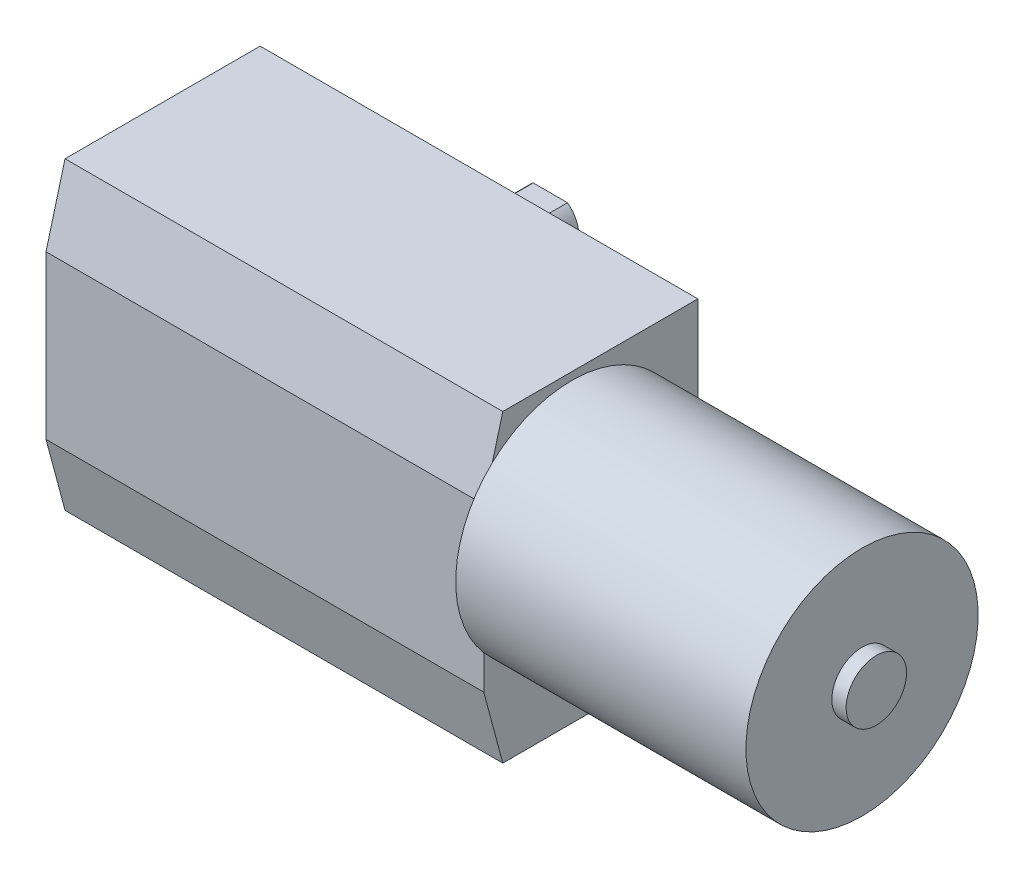
ISO-10303-21;
HEADER;
FILE_DESCRIPTION(('STEP AP214'),'2;1');
FILE_NAME('part.step','',(''),(''),'','','');
FILE_SCHEMA(('AUTOMOTIVE_DESIGN { 1 0 10303 214 1 1 1 1 }'));
ENDSEC;
DATA;
#1=APPLICATION_CONTEXT('core data for automotive mechanical design processes');
#2=APPLICATION_PROTOCOL_DEFINITION('international standard','automotive_design',2000,#1);
#3=PRODUCT_CONTEXT('',#1,'mechanical');
#4=PRODUCT('Part','Part','',(#3));
#5=PRODUCT_RELATED_PRODUCT_CATEGORY('part','',(#4));
#6=PRODUCT_DEFINITION_FORMATION('','',#4);
#7=PRODUCT_DEFINITION_CONTEXT('part definition',#1,'design');
#8=PRODUCT_DEFINITION('design','',#6,#7);
#9=PRODUCT_DEFINITION_SHAPE('','',#8);
#10=(LENGTH_UNIT() NAMED_UNIT(*) SI_UNIT(.MILLI.,.METRE.));
#11=(NAMED_UNIT(*) PLANE_ANGLE_UNIT() SI_UNIT($,.RADIAN.));
#12=(NAMED_UNIT(*) SI_UNIT($,.STERADIAN.) SOLID_ANGLE_UNIT());
#13=UNCERTAINTY_MEASURE_WITH_UNIT(LENGTH_MEASURE(1.E-05),#10,'distance_accuracy_value','');
#14=(GEOMETRIC_REPRESENTATION_CONTEXT(3) GLOBAL_UNCERTAINTY_ASSIGNED_CONTEXT((#13)) GLOBAL_UNIT_ASSIGNED_CONTEXT((#10,
#11,#12)) REPRESENTATION_CONTEXT('',''));
#15=CARTESIAN_POINT('',(0.,0.,0.));
#16=DIRECTION('',(0.,0.,1.));
#17=DIRECTION('',(1.,0.,0.));
#18=AXIS2_PLACEMENT_3D('',#15,#16,#17);
#19=CARTESIAN_POINT('',(61.5,3.00000000000001,2.));
#20=DIRECTION('',(1.,0.,0.));
#21=DIRECTION('',(0.,1.,0.));
#22=AXIS2_PLACEMENT_3D('',#19,#20,#21);
#23=PLANE('',#22);
#24=CARTESIAN_POINT('',(61.5,3.00000000000001,2.));
#25=DIRECTION('',(-1.,0.,0.));
#26=DIRECTION('',(0.,1.,0.));
#27=AXIS2_PLACEMENT_3D('',#24,#25,#26);
#28=CIRCLE('',#27,12.2);
#29=CARTESIAN_POINT('',(61.5,15.2,2.));
#30=VERTEX_POINT('',#29);
#31=EDGE_CURVE('E132',#30,#30,#28,.T.);
#32=ORIENTED_EDGE('',*,*,#31,.F.);
#33=EDGE_LOOP('',(#32));
#34=FACE_BOUND('',#33,.T.);
#35=CARTESIAN_POINT('',(61.5,3.00000000000001,2.));
#36=DIRECTION('',(-1.,0.,0.));
#37=DIRECTION('',(0.,1.,0.));
#38=AXIS2_PLACEMENT_3D('',#35,#36,#37);
#39=CIRCLE('',#38,3.175);
#40=CARTESIAN_POINT('',(61.5,6.17500000000001,2.));
#41=VERTEX_POINT('',#40);
#42=EDGE_CURVE('E437',#41,#41,#39,.T.);
#43=ORIENTED_EDGE('',*,*,#42,.T.);
#44=EDGE_LOOP('',(#43));
#45=FACE_BOUND('',#44,.T.);
#46=ADVANCED_FACE('F45',(#34,#45),#23,.T.);
#47=CARTESIAN_POINT('',(31.,16.,-11.25));
#48=DIRECTION('',(-1.,0.,0.));
#49=DIRECTION('',(0.,-1.,0.));
#50=AXIS2_PLACEMENT_3D('',#47,#48,#49);
#51=PLANE('',#50);
#52=CARTESIAN_POINT('',(31.,3.,2.));
#53=DIRECTION('',(-1.,0.,0.));
#54=DIRECTION('',(0.,1.,0.));
#55=AXIS2_PLACEMENT_3D('',#52,#53,#54);
#56=CIRCLE('',#55,12.2);
#57=CARTESIAN_POINT('',(31.,11.894821257883,10.3499793287357));
#58=VERTEX_POINT('',#57);
#59=CARTESIAN_POINT('',(31.,-4.95471558259627,11.25));
#60=VERTEX_POINT('',#59);
#61=EDGE_CURVE('E12',#58,#60,#56,.T.);
#62=ORIENTED_EDGE('',*,*,#61,.T.);
#63=DIRECTION('',(0.,1.,0.));
#64=VECTOR('',#63,1.);
#65=CARTESIAN_POINT('',(31.,16.,11.25));
#66=LINE('',#65,#64);
#67=CARTESIAN_POINT('',(31.,-8.53589838486227,11.25));
#68=VERTEX_POINT('',#67);
#69=EDGE_CURVE('E141',#68,#60,#66,.T.);
#70=ORIENTED_EDGE('',*,*,#69,.F.);
#71=DIRECTION('',(0.,-0.965925826289068,-0.258819045102522));
#72=VECTOR('',#71,1.);
#73=CARTESIAN_POINT('',(31.,-16.,9.25));
#74=LINE('',#73,#72);
#75=CARTESIAN_POINT('',(31.,-16.,9.25));
#76=VERTEX_POINT('',#75);
#77=EDGE_CURVE('E161',#76,#68,#74,.F.);
#78=ORIENTED_EDGE('',*,*,#77,.F.);
#79=DIRECTION('',(0.,0.,1.));
#80=VECTOR('',#79,1.);
#81=CARTESIAN_POINT('',(31.,-16.,-11.25));
#82=LINE('',#81,#80);
#83=CARTESIAN_POINT('',(31.,-16.,-11.25));
#84=VERTEX_POINT('',#83);
#85=EDGE_CURVE('E186',#84,#76,#82,.T.);
#86=ORIENTED_EDGE('',*,*,#85,.F.);
#87=DIRECTION('',(0.,1.,0.));
#88=VECTOR('',#87,1.);
#89=CARTESIAN_POINT('',(31.,16.,-11.25));
#90=LINE('',#89,#88);
#91=CARTESIAN_POINT('',(31.,16.,-11.25));
#92=VERTEX_POINT('',#91);
#93=EDGE_CURVE('E229',#84,#92,#90,.T.);
#94=ORIENTED_EDGE('',*,*,#93,.T.);
#95=DIRECTION('',(0.,0.,1.));
#96=VECTOR('',#95,1.);
#97=CARTESIAN_POINT('',(31.,16.,-11.25));
#98=LINE('',#97,#96);
#99=CARTESIAN_POINT('',(31.,16.,9.24999999999999));
#100=VERTEX_POINT('',#99);
#101=EDGE_CURVE('E158',#92,#100,#98,.T.);
#102=ORIENTED_EDGE('',*,*,#101,.T.);
#103=DIRECTION('',(0.,-0.965925826289068,0.258819045102522));
#104=VECTOR('',#103,1.);
#105=CARTESIAN_POINT('',(31.,16.,9.25));
#106=LINE('',#105,#104);
#107=EDGE_CURVE('E155',#58,#100,#106,.F.);
#108=ORIENTED_EDGE('',*,*,#107,.F.);
#109=EDGE_LOOP('',(#62,#70,#78,#86,#94,#102,#108));
#110=FACE_BOUND('',#109,.T.);
#111=ADVANCED_FACE('F153',(#110),#51,.F.);
#112=CARTESIAN_POINT('',(0.,0.,-12.75));
#113=DIRECTION('',(0.,0.,-1.));
#114=DIRECTION('',(1.,0.,0.));
#115=AXIS2_PLACEMENT_3D('',#112,#113,#114);
#116=PLANE('',#115);
#117=CARTESIAN_POINT('',(0.,0.,-12.75));
#118=DIRECTION('',(0.,0.,1.));
#119=DIRECTION('',(1.,0.,0.));
#120=AXIS2_PLACEMENT_3D('',#117,#118,#119);
#121=CIRCLE('',#120,6.);
#122=CARTESIAN_POINT('',(6.,0.,-12.75));
#123=VERTEX_POINT('',#122);
#124=EDGE_CURVE('E221',#123,#123,#121,.T.);
#125=ORIENTED_EDGE('',*,*,#124,.F.);
#126=EDGE_LOOP('',(#125));
#127=FACE_BOUND('',#126,.T.);
#128=CARTESIAN_POINT('',(0.,0.,-12.75));
#129=DIRECTION('',(0.,0.,1.));
#130=DIRECTION('',(1.,0.,0.));
#131=AXIS2_PLACEMENT_3D('',#128,#129,#130);
#132=CIRCLE('',#131,3.);
#133=CARTESIAN_POINT('',(3.,0.,-12.75));
#134=VERTEX_POINT('',#133);
#135=EDGE_CURVE('E389',#134,#134,#132,.T.);
#136=ORIENTED_EDGE('',*,*,#135,.T.);
#137=EDGE_LOOP('',(#136));
#138=FACE_BOUND('',#137,.T.);
#139=ADVANCED_FACE('F252',(#127,#138),#116,.T.);
#140=CARTESIAN_POINT('',(0.,0.,-11.25));
#141=DIRECTION('',(0.,0.,-1.));
#142=DIRECTION('',(1.,0.,0.));
#143=AXIS2_PLACEMENT_3D('',#140,#141,#142);
#144=PLANE('',#143);
#145=CARTESIAN_POINT('',(24.,9.,-11.25));
#146=DIRECTION('',(0.,0.,1.));
#147=DIRECTION('',(1.,0.,0.));
#148=AXIS2_PLACEMENT_3D('',#145,#146,#147);
#149=CIRCLE('',#148,3.825);
#150=CARTESIAN_POINT('',(27.825,9.,-11.25));
#151=VERTEX_POINT('',#150);
#152=EDGE_CURVE('E195',#151,#151,#149,.T.);
#153=ORIENTED_EDGE('',*,*,#152,.T.);
#154=EDGE_LOOP('',(#153));
#155=FACE_BOUND('',#154,.T.);
#156=CARTESIAN_POINT('',(-9.,9.,-11.25));
#157=DIRECTION('',(0.,0.,1.));
#158=DIRECTION('',(1.,0.,0.));
#159=AXIS2_PLACEMENT_3D('',#156,#157,#158);
#160=CIRCLE('',#159,3.825);
#161=CARTESIAN_POINT('',(-5.175,9.,-11.25));
#162=VERTEX_POINT('',#161);
#163=EDGE_CURVE('E201',#162,#162,#160,.T.);
#164=ORIENTED_EDGE('',*,*,#163,.T.);
#165=EDGE_LOOP('',(#164));
#166=FACE_BOUND('',#165,.T.);
#167=DIRECTION('',(0.,-1.,0.));
#168=VECTOR('',#167,1.);
#169=CARTESIAN_POINT('',(-15.,16.,-11.25));
#170=LINE('',#169,#168);
#171=CARTESIAN_POINT('',(-15.,16.,-11.25));
#172=VERTEX_POINT('',#171);
#173=CARTESIAN_POINT('',(-15.,-16.,-11.25));
#174=VERTEX_POINT('',#173);
#175=EDGE_CURVE('E151',#172,#174,#170,.T.);
#176=ORIENTED_EDGE('',*,*,#175,.F.);
#177=DIRECTION('',(-1.,0.,0.));
#178=VECTOR('',#177,1.);
#179=CARTESIAN_POINT('',(-15.,16.,-11.25));
#180=LINE('',#179,#178);
#181=EDGE_CURVE('E231',#92,#172,#180,.T.);
#182=ORIENTED_EDGE('',*,*,#181,.F.);
#183=ORIENTED_EDGE('',*,*,#93,.F.);
#184=DIRECTION('',(1.,0.,0.));
#185=VECTOR('',#184,1.);
#186=CARTESIAN_POINT('',(-15.,-16.,-11.25));
#187=LINE('',#186,#185);
#188=EDGE_CURVE('E227',#174,#84,#187,.T.);
#189=ORIENTED_EDGE('',*,*,#188,.F.);
#190=EDGE_LOOP('',(#176,#182,#183,#189));
#191=FACE_BOUND('',#190,.T.);
#192=CARTESIAN_POINT('',(0.,0.,-11.25));
#193=DIRECTION('',(0.,0.,1.));
#194=DIRECTION('',(1.,0.,0.));
#195=AXIS2_PLACEMENT_3D('',#192,#193,#194);
#196=CIRCLE('',#195,6.);
#197=CARTESIAN_POINT('',(6.,0.,-11.25));
#198=VERTEX_POINT('',#197);
#199=EDGE_CURVE('E200',#198,#198,#196,.T.);
#200=ORIENTED_EDGE('',*,*,#199,.T.);
#201=EDGE_LOOP('',(#200));
#202=FACE_BOUND('',#201,.T.);
#203=CARTESIAN_POINT('',(-9.,-9.,-11.25));
#204=DIRECTION('',(0.,0.,1.));
#205=DIRECTION('',(1.,0.,0.));
#206=AXIS2_PLACEMENT_3D('',#203,#204,#205);
#207=CIRCLE('',#206,3.825);
#208=CARTESIAN_POINT('',(-5.175,-9.,-11.25));
#209=VERTEX_POINT('',#208);
#210=EDGE_CURVE('E205',#209,#209,#207,.T.);
#211=ORIENTED_EDGE('',*,*,#210,.T.);
#212=EDGE_LOOP('',(#211));
#213=FACE_BOUND('',#212,.T.);
#214=CARTESIAN_POINT('',(24.,-9.,-11.25));
#215=DIRECTION('',(0.,0.,1.));
#216=DIRECTION('',(1.,0.,0.));
#217=AXIS2_PLACEMENT_3D('',#214,#215,#216);
#218=CIRCLE('',#217,3.825);
#219=CARTESIAN_POINT('',(27.825,-9.,-11.25));
#220=VERTEX_POINT('',#219);
#221=EDGE_CURVE('E196',#220,#220,#218,.T.);
#222=ORIENTED_EDGE('',*,*,#221,.T.);
#223=EDGE_LOOP('',(#222));
#224=FACE_BOUND('',#223,.T.);
#225=ADVANCED_FACE('F341',(#155,#166,#191,#202,#213,#224),#144,.T.);
#226=CARTESIAN_POINT('',(-15.,16.,-11.25));
#227=DIRECTION('',(1.,0.,0.));
#228=DIRECTION('',(0.,1.,0.));
#229=AXIS2_PLACEMENT_3D('',#226,#227,#228);
#230=PLANE('',#229);
#231=DIRECTION('',(0.,-1.,0.));
#232=VECTOR('',#231,1.);
#233=CARTESIAN_POINT('',(-15.,16.,11.25));
#234=LINE('',#233,#232);
#235=CARTESIAN_POINT('',(-15.,8.53589838486227,11.25));
#236=VERTEX_POINT('',#235);
#237=CARTESIAN_POINT('',(-15.,-8.53589838486205,11.25));
#238=VERTEX_POINT('',#237);
#239=EDGE_CURVE('E142',#236,#238,#234,.T.);
#240=ORIENTED_EDGE('',*,*,#239,.F.);
#241=DIRECTION('',(0.,0.965925826289068,-0.258819045102522));
#242=VECTOR('',#241,1.);
#243=CARTESIAN_POINT('',(-15.,16.,9.25));
#244=LINE('',#243,#242);
#245=CARTESIAN_POINT('',(-15.,16.,9.24999999999999));
#246=VERTEX_POINT('',#245);
#247=EDGE_CURVE('E170',#246,#236,#244,.F.);
#248=ORIENTED_EDGE('',*,*,#247,.F.);
#249=DIRECTION('',(0.,0.,1.));
#250=VECTOR('',#249,1.);
#251=CARTESIAN_POINT('',(-15.,16.,-11.25));
#252=LINE('',#251,#250);
#253=EDGE_CURVE('E234',#172,#246,#252,.T.);
#254=ORIENTED_EDGE('',*,*,#253,.F.);
#255=ORIENTED_EDGE('',*,*,#175,.T.);
#256=DIRECTION('',(0.,0.,1.));
#257=VECTOR('',#256,1.);
#258=CARTESIAN_POINT('',(-15.,-16.,-11.25));
#259=LINE('',#258,#257);
#260=CARTESIAN_POINT('',(-15.,-16.,9.25));
#261=VERTEX_POINT('',#260);
#262=EDGE_CURVE('E181',#174,#261,#259,.T.);
#263=ORIENTED_EDGE('',*,*,#262,.T.);
#264=DIRECTION('',(0.,0.965925826289068,0.258819045102522));
#265=VECTOR('',#264,1.);
#266=CARTESIAN_POINT('',(-15.,-16.,9.25));
#267=LINE('',#266,#265);
#268=EDGE_CURVE('E171',#238,#261,#267,.F.);
#269=ORIENTED_EDGE('',*,*,#268,.F.);
#270=EDGE_LOOP('',(#240,#248,#254,#255,#263,#269));
#271=FACE_BOUND('',#270,.T.);
#272=ADVANCED_FACE('F182',(#271),#230,.F.);
#273=CARTESIAN_POINT('',(-15.,-16.,-11.25));
#274=DIRECTION('',(0.,1.,0.));
#275=DIRECTION('',(-1.,0.,0.));
#276=AXIS2_PLACEMENT_3D('',#273,#274,#275);
#277=PLANE('',#276);
#278=ORIENTED_EDGE('',*,*,#262,.F.);
#279=ORIENTED_EDGE('',*,*,#188,.T.);
#280=ORIENTED_EDGE('',*,*,#85,.T.);
#281=DIRECTION('',(1.,0.,0.));
#282=VECTOR('',#281,1.);
#283=CARTESIAN_POINT('',(-15.,-16.,9.25));
#284=LINE('',#283,#282);
#285=EDGE_CURVE('E159',#261,#76,#284,.T.);
#286=ORIENTED_EDGE('',*,*,#285,.F.);
#287=EDGE_LOOP('',(#278,#279,#280,#286));
#288=FACE_BOUND('',#287,.T.);
#289=ADVANCED_FACE('F351',(#288),#277,.F.);
#290=CARTESIAN_POINT('',(-15.,16.,-11.25));
#291=DIRECTION('',(0.,-1.,0.));
#292=DIRECTION('',(0.,0.,1.));
#293=AXIS2_PLACEMENT_3D('',#290,#291,#292);
#294=PLANE('',#293);
#295=ORIENTED_EDGE('',*,*,#101,.F.);
#296=ORIENTED_EDGE('',*,*,#181,.T.);
#297=ORIENTED_EDGE('',*,*,#253,.T.);
#298=DIRECTION('',(-1.,0.,0.));
#299=VECTOR('',#298,1.);
#300=CARTESIAN_POINT('',(-15.,16.,9.25));
#301=LINE('',#300,#299);
#302=EDGE_CURVE('E49',#100,#246,#301,.T.);
#303=ORIENTED_EDGE('',*,*,#302,.F.);
#304=EDGE_LOOP('',(#295,#296,#297,#303));
#305=FACE_BOUND('',#304,.T.);
#306=ADVANCED_FACE('F238',(#305),#294,.F.);
#307=CARTESIAN_POINT('',(0.,0.,11.25));
#308=DIRECTION('',(0.,0.,-1.));
#309=DIRECTION('',(1.,0.,0.));
#310=AXIS2_PLACEMENT_3D('',#307,#308,#309);
#311=PLANE('',#310);
#312=ORIENTED_EDGE('',*,*,#69,.T.);
#313=CARTESIAN_POINT('',(31.,8.53589838486226,11.25));
#314=VERTEX_POINT('',#313);
#315=EDGE_CURVE('E135',#60,#314,#66,.T.);
#316=ORIENTED_EDGE('',*,*,#315,.T.);
#317=DIRECTION('',(1.,0.,0.));
#318=VECTOR('',#317,1.);
#319=CARTESIAN_POINT('',(0.,8.53589838486227,11.25));
#320=LINE('',#319,#318);
#321=EDGE_CURVE('E167',#236,#314,#320,.T.);
#322=ORIENTED_EDGE('',*,*,#321,.F.);
#323=ORIENTED_EDGE('',*,*,#239,.T.);
#324=DIRECTION('',(-1.,0.,0.));
#325=VECTOR('',#324,1.);
#326=CARTESIAN_POINT('',(0.,-8.53589838486228,11.25));
#327=LINE('',#326,#325);
#328=EDGE_CURVE('E147',#68,#238,#327,.T.);
#329=ORIENTED_EDGE('',*,*,#328,.F.);
#330=EDGE_LOOP('',(#312,#316,#322,#323,#329));
#331=FACE_BOUND('',#330,.T.);
#332=ADVANCED_FACE('F145',(#331),#311,.F.);
#333=CARTESIAN_POINT('',(0.,0.,-12.75));
#334=DIRECTION('',(0.,0.,1.));
#335=DIRECTION('',(-1.,0.,0.));
#336=AXIS2_PLACEMENT_3D('',#333,#334,#335);
#337=CYLINDRICAL_SURFACE('',#336,6.);
#338=ORIENTED_EDGE('',*,*,#124,.T.);
#339=EDGE_LOOP('',(#338));
#340=FACE_BOUND('',#339,.T.);
#341=ORIENTED_EDGE('',*,*,#199,.F.);
#342=EDGE_LOOP('',(#341));
#343=FACE_BOUND('',#342,.T.);
#344=ADVANCED_FACE('F337',(#340,#343),#337,.T.);
#345=CARTESIAN_POINT('',(-9.,9.,-12.75));
#346=DIRECTION('',(0.,0.,1.));
#347=DIRECTION('',(-1.,0.,0.));
#348=AXIS2_PLACEMENT_3D('',#345,#346,#347);
#349=CYLINDRICAL_SURFACE('',#348,3.825);
#350=CARTESIAN_POINT('',(-9.,9.,-13.25));
#351=DIRECTION('',(0.,0.,1.));
#352=DIRECTION('',(1.,0.,0.));
#353=AXIS2_PLACEMENT_3D('',#350,#351,#352);
#354=CIRCLE('',#353,3.825);
#355=CARTESIAN_POINT('',(-5.175,9.,-13.25));
#356=VERTEX_POINT('',#355);
#357=EDGE_CURVE('E197',#356,#356,#354,.T.);
#358=ORIENTED_EDGE('',*,*,#357,.T.);
#359=EDGE_LOOP('',(#358));
#360=FACE_BOUND('',#359,.T.);
#361=ORIENTED_EDGE('',*,*,#163,.F.);
#362=EDGE_LOOP('',(#361));
#363=FACE_BOUND('',#362,.T.);
#364=ADVANCED_FACE('F334',(#360,#363),#349,.T.);
#365=CARTESIAN_POINT('',(-9.,9.,-13.25));
#366=DIRECTION('',(0.,0.,-1.));
#367=DIRECTION('',(1.,0.,0.));
#368=AXIS2_PLACEMENT_3D('',#365,#366,#367);
#369=PLANE('',#368);
#370=CARTESIAN_POINT('',(-9.,9.,-13.25));
#371=DIRECTION('',(0.,0.,1.));
#372=DIRECTION('',(1.,0.,0.));
#373=AXIS2_PLACEMENT_3D('',#370,#371,#372);
#374=CIRCLE('',#373,1.24999999999999);
#375=CARTESIAN_POINT('',(-7.75000000000001,9.,-13.25));
#376=VERTEX_POINT('',#375);
#377=EDGE_CURVE('E373',#376,#376,#374,.T.);
#378=ORIENTED_EDGE('',*,*,#377,.T.);
#379=EDGE_LOOP('',(#378));
#380=FACE_BOUND('',#379,.T.);
#381=ORIENTED_EDGE('',*,*,#357,.F.);
#382=EDGE_LOOP('',(#381));
#383=FACE_BOUND('',#382,.T.);
#384=ADVANCED_FACE('F332',(#380,#383),#369,.T.);
#385=CARTESIAN_POINT('',(-9.,-9.,-12.75));
#386=DIRECTION('',(0.,0.,1.));
#387=DIRECTION('',(-1.,0.,0.));
#388=AXIS2_PLACEMENT_3D('',#385,#386,#387);
#389=CYLINDRICAL_SURFACE('',#388,3.825);
#390=CARTESIAN_POINT('',(-9.,-9.,-13.25));
#391=DIRECTION('',(0.,0.,1.));
#392=DIRECTION('',(1.,0.,0.));
#393=AXIS2_PLACEMENT_3D('',#390,#391,#392);
#394=CIRCLE('',#393,3.825);
#395=CARTESIAN_POINT('',(-5.175,-9.,-13.25));
#396=VERTEX_POINT('',#395);
#397=EDGE_CURVE('E202',#396,#396,#394,.T.);
#398=ORIENTED_EDGE('',*,*,#397,.T.);
#399=EDGE_LOOP('',(#398));
#400=FACE_BOUND('',#399,.T.);
#401=ORIENTED_EDGE('',*,*,#210,.F.);
#402=EDGE_LOOP('',(#401));
#403=FACE_BOUND('',#402,.T.);
#404=ADVANCED_FACE('F329',(#400,#403),#389,.T.);
#405=CARTESIAN_POINT('',(-9.,-9.,-13.25));
#406=DIRECTION('',(0.,0.,-1.));
#407=DIRECTION('',(1.,0.,0.));
#408=AXIS2_PLACEMENT_3D('',#405,#406,#407);
#409=PLANE('',#408);
#410=CARTESIAN_POINT('',(-9.,-9.,-13.25));
#411=DIRECTION('',(0.,0.,1.));
#412=DIRECTION('',(1.,0.,0.));
#413=AXIS2_PLACEMENT_3D('',#410,#411,#412);
#414=CIRCLE('',#413,1.24999999999999);
#415=CARTESIAN_POINT('',(-7.75000000000001,-9.,-13.25));
#416=VERTEX_POINT('',#415);
#417=EDGE_CURVE('E420',#416,#416,#414,.T.);
#418=ORIENTED_EDGE('',*,*,#417,.T.);
#419=EDGE_LOOP('',(#418));
#420=FACE_BOUND('',#419,.T.);
#421=ORIENTED_EDGE('',*,*,#397,.F.);
#422=EDGE_LOOP('',(#421));
#423=FACE_BOUND('',#422,.T.);
#424=ADVANCED_FACE('F328',(#420,#423),#409,.T.);
#425=CARTESIAN_POINT('',(24.,9.,-12.75));
#426=DIRECTION('',(0.,0.,1.));
#427=DIRECTION('',(-1.,0.,0.));
#428=AXIS2_PLACEMENT_3D('',#425,#426,#427);
#429=CYLINDRICAL_SURFACE('',#428,3.825);
#430=CARTESIAN_POINT('',(24.,9.,-13.25));
#431=DIRECTION('',(0.,0.,1.));
#432=DIRECTION('',(1.,0.,0.));
#433=AXIS2_PLACEMENT_3D('',#430,#431,#432);
#434=CIRCLE('',#433,3.825);
#435=CARTESIAN_POINT('',(27.825,9.,-13.25));
#436=VERTEX_POINT('',#435);
#437=EDGE_CURVE('E206',#436,#436,#434,.T.);
#438=ORIENTED_EDGE('',*,*,#437,.T.);
#439=EDGE_LOOP('',(#438));
#440=FACE_BOUND('',#439,.T.);
#441=ORIENTED_EDGE('',*,*,#152,.F.);
#442=EDGE_LOOP('',(#441));
#443=FACE_BOUND('',#442,.T.);
#444=ADVANCED_FACE('F325',(#440,#443),#429,.T.);
#445=CARTESIAN_POINT('',(24.,9.,-13.25));
#446=DIRECTION('',(0.,0.,-1.));
#447=DIRECTION('',(1.,0.,0.));
#448=AXIS2_PLACEMENT_3D('',#445,#446,#447);
#449=PLANE('',#448);
#450=CARTESIAN_POINT('',(24.,9.,-13.25));
#451=DIRECTION('',(0.,0.,1.));
#452=DIRECTION('',(1.,0.,0.));
#453=AXIS2_PLACEMENT_3D('',#450,#451,#452);
#454=CIRCLE('',#453,1.24999999999999);
#455=CARTESIAN_POINT('',(25.25,9.,-13.25));
#456=VERTEX_POINT('',#455);
#457=EDGE_CURVE('E414',#456,#456,#454,.T.);
#458=ORIENTED_EDGE('',*,*,#457,.T.);
#459=EDGE_LOOP('',(#458));
#460=FACE_BOUND('',#459,.T.);
#461=ORIENTED_EDGE('',*,*,#437,.F.);
#462=EDGE_LOOP('',(#461));
#463=FACE_BOUND('',#462,.T.);
#464=ADVANCED_FACE('F323',(#460,#463),#449,.T.);
#465=CARTESIAN_POINT('',(24.,-9.,-12.75));
#466=DIRECTION('',(0.,0.,1.));
#467=DIRECTION('',(-1.,0.,0.));
#468=AXIS2_PLACEMENT_3D('',#465,#466,#467);
#469=CYLINDRICAL_SURFACE('',#468,3.825);
#470=CARTESIAN_POINT('',(24.,-9.,-13.25));
#471=DIRECTION('',(0.,0.,1.));
#472=DIRECTION('',(1.,0.,0.));
#473=AXIS2_PLACEMENT_3D('',#470,#471,#472);
#474=CIRCLE('',#473,3.825);
#475=CARTESIAN_POINT('',(27.825,-9.,-13.25));
#476=VERTEX_POINT('',#475);
#477=EDGE_CURVE('E192',#476,#476,#474,.T.);
#478=ORIENTED_EDGE('',*,*,#477,.T.);
#479=EDGE_LOOP('',(#478));
#480=FACE_BOUND('',#479,.T.);
#481=ORIENTED_EDGE('',*,*,#221,.F.);
#482=EDGE_LOOP('',(#481));
#483=FACE_BOUND('',#482,.T.);
#484=ADVANCED_FACE('F320',(#480,#483),#469,.T.);
#485=CARTESIAN_POINT('',(24.,-9.,-13.25));
#486=DIRECTION('',(0.,0.,-1.));
#487=DIRECTION('',(1.,0.,0.));
#488=AXIS2_PLACEMENT_3D('',#485,#486,#487);
#489=PLANE('',#488);
#490=CARTESIAN_POINT('',(24.,-9.,-13.25));
#491=DIRECTION('',(0.,0.,1.));
#492=DIRECTION('',(1.,0.,0.));
#493=AXIS2_PLACEMENT_3D('',#490,#491,#492);
#494=CIRCLE('',#493,1.24999999999999);
#495=CARTESIAN_POINT('',(25.25,-9.,-13.25));
#496=VERTEX_POINT('',#495);
#497=EDGE_CURVE('E408',#496,#496,#494,.T.);
#498=ORIENTED_EDGE('',*,*,#497,.T.);
#499=EDGE_LOOP('',(#498));
#500=FACE_BOUND('',#499,.T.);
#501=ORIENTED_EDGE('',*,*,#477,.F.);
#502=EDGE_LOOP('',(#501));
#503=FACE_BOUND('',#502,.T.);
#504=ADVANCED_FACE('F318',(#500,#503),#489,.T.);
#505=CARTESIAN_POINT('',(0.,0.,-26.75));
#506=DIRECTION('',(0.,0.,1.));
#507=DIRECTION('',(-1.,0.,0.));
#508=AXIS2_PLACEMENT_3D('',#505,#506,#507);
#509=CYLINDRICAL_SURFACE('',#508,3.);
#510=CARTESIAN_POINT('',(0.,0.,-26.75));
#511=DIRECTION('',(0.,0.,1.));
#512=DIRECTION('',(1.,0.,0.));
#513=AXIS2_PLACEMENT_3D('',#510,#511,#512);
#514=CIRCLE('',#513,3.);
#515=CARTESIAN_POINT('',(-1.8,2.4,-26.75));
#516=VERTEX_POINT('',#515);
#517=CARTESIAN_POINT('',(1.8,2.4,-26.75));
#518=VERTEX_POINT('',#517);
#519=EDGE_CURVE('E387',#516,#518,#514,.T.);
#520=ORIENTED_EDGE('',*,*,#519,.T.);
#521=DIRECTION('',(0.,0.,-1.));
#522=VECTOR('',#521,1.);
#523=CARTESIAN_POINT('',(1.8,2.4,-14.75));
#524=LINE('',#523,#522);
#525=CARTESIAN_POINT('',(1.8,2.4,-14.75));
#526=VERTEX_POINT('',#525);
#527=EDGE_CURVE('E395',#526,#518,#524,.T.);
#528=ORIENTED_EDGE('',*,*,#527,.F.);
#529=CARTESIAN_POINT('',(0.,0.,-14.75));
#530=DIRECTION('',(0.,0.,1.));
#531=DIRECTION('',(1.,0.,0.));
#532=AXIS2_PLACEMENT_3D('',#529,#530,#531);
#533=CIRCLE('',#532,3.);
#534=CARTESIAN_POINT('',(-1.8,2.4,-14.75));
#535=VERTEX_POINT('',#534);
#536=EDGE_CURVE('E162',#526,#535,#533,.T.);
#537=ORIENTED_EDGE('',*,*,#536,.T.);
#538=DIRECTION('',(0.,0.,-1.));
#539=VECTOR('',#538,1.);
#540=CARTESIAN_POINT('',(-1.8,2.4,-14.75));
#541=LINE('',#540,#539);
#542=EDGE_CURVE('E397',#535,#516,#541,.T.);
#543=ORIENTED_EDGE('',*,*,#542,.T.);
#544=EDGE_LOOP('',(#520,#528,#537,#543));
#545=FACE_BOUND('',#544,.T.);
#546=ORIENTED_EDGE('',*,*,#135,.F.);
#547=EDGE_LOOP('',(#546));
#548=FACE_BOUND('',#547,.T.);
#549=ADVANCED_FACE('F314',(#545,#548),#509,.T.);
#550=CARTESIAN_POINT('',(0.,0.,-26.75));
#551=DIRECTION('',(0.,0.,-1.));
#552=DIRECTION('',(1.,0.,0.));
#553=AXIS2_PLACEMENT_3D('',#550,#551,#552);
#554=PLANE('',#553);
#555=CARTESIAN_POINT('',(0.,0.,-26.75));
#556=DIRECTION('',(0.,0.,1.));
#557=DIRECTION('',(1.,0.,0.));
#558=AXIS2_PLACEMENT_3D('',#555,#556,#557);
#559=CIRCLE('',#558,1.24999999999999);
#560=CARTESIAN_POINT('',(1.24999999999999,0.,-26.75));
#561=VERTEX_POINT('',#560);
#562=EDGE_CURVE('E430',#561,#561,#559,.T.);
#563=ORIENTED_EDGE('',*,*,#562,.T.);
#564=EDGE_LOOP('',(#563));
#565=FACE_BOUND('',#564,.T.);
#566=DIRECTION('',(1.,0.,0.));
#567=VECTOR('',#566,1.);
#568=CARTESIAN_POINT('',(-1.8,2.4,-26.75));
#569=LINE('',#568,#567);
#570=EDGE_CURVE('E402',#516,#518,#569,.T.);
#571=ORIENTED_EDGE('',*,*,#570,.T.);
#572=ORIENTED_EDGE('',*,*,#519,.F.);
#573=EDGE_LOOP('',(#571,#572));
#574=FACE_BOUND('',#573,.T.);
#575=ADVANCED_FACE('F307',(#565,#574),#554,.T.);
#576=CARTESIAN_POINT('',(0.,0.,-14.75));
#577=DIRECTION('',(0.,0.,-1.));
#578=DIRECTION('',(1.,0.,0.));
#579=AXIS2_PLACEMENT_3D('',#576,#577,#578);
#580=PLANE('',#579);
#581=DIRECTION('',(1.,0.,0.));
#582=VECTOR('',#581,1.);
#583=CARTESIAN_POINT('',(-1.8,2.4,-14.75));
#584=LINE('',#583,#582);
#585=EDGE_CURVE('E399',#535,#526,#584,.T.);
#586=ORIENTED_EDGE('',*,*,#585,.F.);
#587=ORIENTED_EDGE('',*,*,#536,.F.);
#588=EDGE_LOOP('',(#586,#587));
#589=FACE_BOUND('',#588,.T.);
#590=ADVANCED_FACE('F304',(#589),#580,.T.);
#591=CARTESIAN_POINT('',(-1.8,2.4,-14.75));
#592=DIRECTION('',(0.,-1.,0.));
#593=DIRECTION('',(0.,0.,1.));
#594=AXIS2_PLACEMENT_3D('',#591,#592,#593);
#595=PLANE('',#594);
#596=ORIENTED_EDGE('',*,*,#570,.F.);
#597=ORIENTED_EDGE('',*,*,#542,.F.);
#598=ORIENTED_EDGE('',*,*,#585,.T.);
#599=ORIENTED_EDGE('',*,*,#527,.T.);
#600=EDGE_LOOP('',(#596,#597,#598,#599));
#601=FACE_BOUND('',#600,.T.);
#602=ADVANCED_FACE('F302',(#601),#595,.F.);
#603=CARTESIAN_POINT('',(24.,-9.,-4.75));
#604=DIRECTION('',(0.,0.,-1.));
#605=DIRECTION('',(1.,0.,0.));
#606=AXIS2_PLACEMENT_3D('',#603,#604,#605);
#607=CONICAL_SURFACE('',#606,1.25,1.02974425867665);
#608=CARTESIAN_POINT('',(24.,-9.,-3.99892422621555));
#609=VERTEX_POINT('',#608);
#610=VERTEX_LOOP('',#609);
#611=FACE_BOUND('',#610,.T.);
#612=CARTESIAN_POINT('',(24.,-9.,-4.75));
#613=DIRECTION('',(0.,0.,1.));
#614=DIRECTION('',(1.,0.,0.));
#615=AXIS2_PLACEMENT_3D('',#612,#613,#614);
#616=CIRCLE('',#615,1.25);
#617=CARTESIAN_POINT('',(25.25,-9.,-4.75));
#618=VERTEX_POINT('',#617);
#619=EDGE_CURVE('E404',#618,#618,#616,.T.);
#620=ORIENTED_EDGE('',*,*,#619,.F.);
#621=EDGE_LOOP('',(#620));
#622=FACE_BOUND('',#621,.T.);
#623=ADVANCED_FACE('F298',(#611,#622),#607,.F.);
#624=CARTESIAN_POINT('',(24.,-9.,-13.25));
#625=DIRECTION('',(0.,0.,-1.));
#626=DIRECTION('',(1.,0.,0.));
#627=AXIS2_PLACEMENT_3D('',#624,#625,#626);
#628=CYLINDRICAL_SURFACE('',#627,1.24999999999999);
#629=ORIENTED_EDGE('',*,*,#619,.T.);
#630=EDGE_LOOP('',(#629));
#631=FACE_BOUND('',#630,.T.);
#632=ORIENTED_EDGE('',*,*,#497,.F.);
#633=EDGE_LOOP('',(#632));
#634=FACE_BOUND('',#633,.T.);
#635=ADVANCED_FACE('F294',(#631,#634),#628,.F.);
#636=CARTESIAN_POINT('',(24.,9.,-4.75));
#637=DIRECTION('',(0.,0.,-1.));
#638=DIRECTION('',(1.,0.,0.));
#639=AXIS2_PLACEMENT_3D('',#636,#637,#638);
#640=CONICAL_SURFACE('',#639,1.25,1.02974425867665);
#641=CARTESIAN_POINT('',(24.,9.,-3.99892422621555));
#642=VERTEX_POINT('',#641);
#643=VERTEX_LOOP('',#642);
#644=FACE_BOUND('',#643,.T.);
#645=CARTESIAN_POINT('',(24.,9.,-4.75));
#646=DIRECTION('',(0.,0.,1.));
#647=DIRECTION('',(1.,0.,0.));
#648=AXIS2_PLACEMENT_3D('',#645,#646,#647);
#649=CIRCLE('',#648,1.25);
#650=CARTESIAN_POINT('',(25.25,9.,-4.75));
#651=VERTEX_POINT('',#650);
#652=EDGE_CURVE('E411',#651,#651,#649,.T.);
#653=ORIENTED_EDGE('',*,*,#652,.F.);
#654=EDGE_LOOP('',(#653));
#655=FACE_BOUND('',#654,.T.);
#656=ADVANCED_FACE('F290',(#644,#655),#640,.F.);
#657=CARTESIAN_POINT('',(24.,9.,-13.25));
#658=DIRECTION('',(0.,0.,-1.));
#659=DIRECTION('',(1.,0.,0.));
#660=AXIS2_PLACEMENT_3D('',#657,#658,#659);
#661=CYLINDRICAL_SURFACE('',#660,1.24999999999999);
#662=ORIENTED_EDGE('',*,*,#652,.T.);
#663=EDGE_LOOP('',(#662));
#664=FACE_BOUND('',#663,.T.);
#665=ORIENTED_EDGE('',*,*,#457,.F.);
#666=EDGE_LOOP('',(#665));
#667=FACE_BOUND('',#666,.T.);
#668=ADVANCED_FACE('F286',(#664,#667),#661,.F.);
#669=CARTESIAN_POINT('',(-9.,-9.,-4.75));
#670=DIRECTION('',(0.,0.,-1.));
#671=DIRECTION('',(1.,0.,0.));
#672=AXIS2_PLACEMENT_3D('',#669,#670,#671);
#673=CONICAL_SURFACE('',#672,1.25,1.02974425867665);
#674=CARTESIAN_POINT('',(-9.,-9.,-3.99892422621555));
#675=VERTEX_POINT('',#674);
#676=VERTEX_LOOP('',#675);
#677=FACE_BOUND('',#676,.T.);
#678=CARTESIAN_POINT('',(-9.,-9.,-4.75));
#679=DIRECTION('',(0.,0.,1.));
#680=DIRECTION('',(1.,0.,0.));
#681=AXIS2_PLACEMENT_3D('',#678,#679,#680);
#682=CIRCLE('',#681,1.25);
#683=CARTESIAN_POINT('',(-7.75,-9.,-4.75));
#684=VERTEX_POINT('',#683);
#685=EDGE_CURVE('E417',#684,#684,#682,.T.);
#686=ORIENTED_EDGE('',*,*,#685,.F.);
#687=EDGE_LOOP('',(#686));
#688=FACE_BOUND('',#687,.T.);
#689=ADVANCED_FACE('F282',(#677,#688),#673,.F.);
#690=CARTESIAN_POINT('',(-9.,-9.,-13.25));
#691=DIRECTION('',(0.,0.,-1.));
#692=DIRECTION('',(1.,0.,0.));
#693=AXIS2_PLACEMENT_3D('',#690,#691,#692);
#694=CYLINDRICAL_SURFACE('',#693,1.24999999999999);
#695=ORIENTED_EDGE('',*,*,#685,.T.);
#696=EDGE_LOOP('',(#695));
#697=FACE_BOUND('',#696,.T.);
#698=ORIENTED_EDGE('',*,*,#417,.F.);
#699=EDGE_LOOP('',(#698));
#700=FACE_BOUND('',#699,.T.);
#701=ADVANCED_FACE('F278',(#697,#700),#694,.F.);
#702=CARTESIAN_POINT('',(-9.,9.,-4.75));
#703=DIRECTION('',(0.,0.,-1.));
#704=DIRECTION('',(1.,0.,0.));
#705=AXIS2_PLACEMENT_3D('',#702,#703,#704);
#706=CONICAL_SURFACE('',#705,1.25,1.02974425867665);
#707=CARTESIAN_POINT('',(-9.,9.,-3.99892422621555));
#708=VERTEX_POINT('',#707);
#709=VERTEX_LOOP('',#708);
#710=FACE_BOUND('',#709,.T.);
#711=CARTESIAN_POINT('',(-9.,9.,-4.75));
#712=DIRECTION('',(0.,0.,1.));
#713=DIRECTION('',(1.,0.,0.));
#714=AXIS2_PLACEMENT_3D('',#711,#712,#713);
#715=CIRCLE('',#714,1.25);
#716=CARTESIAN_POINT('',(-7.75,9.,-4.75));
#717=VERTEX_POINT('',#716);
#718=EDGE_CURVE('E423',#717,#717,#715,.T.);
#719=ORIENTED_EDGE('',*,*,#718,.F.);
#720=EDGE_LOOP('',(#719));
#721=FACE_BOUND('',#720,.T.);
#722=ADVANCED_FACE('F274',(#710,#721),#706,.F.);
#723=CARTESIAN_POINT('',(-9.,9.,-13.25));
#724=DIRECTION('',(0.,0.,-1.));
#725=DIRECTION('',(1.,0.,0.));
#726=AXIS2_PLACEMENT_3D('',#723,#724,#725);
#727=CYLINDRICAL_SURFACE('',#726,1.24999999999999);
#728=ORIENTED_EDGE('',*,*,#718,.T.);
#729=EDGE_LOOP('',(#728));
#730=FACE_BOUND('',#729,.T.);
#731=ORIENTED_EDGE('',*,*,#377,.F.);
#732=EDGE_LOOP('',(#731));
#733=FACE_BOUND('',#732,.T.);
#734=ADVANCED_FACE('F270',(#730,#733),#727,.F.);
#735=CARTESIAN_POINT('',(0.,0.,-18.25));
#736=DIRECTION('',(0.,0.,-1.));
#737=DIRECTION('',(1.,0.,0.));
#738=AXIS2_PLACEMENT_3D('',#735,#736,#737);
#739=CONICAL_SURFACE('',#738,1.24999999999999,1.02974425867665);
#740=CARTESIAN_POINT('',(0.,0.,-17.4989242262156));
#741=VERTEX_POINT('',#740);
#742=VERTEX_LOOP('',#741);
#743=FACE_BOUND('',#742,.T.);
#744=CARTESIAN_POINT('',(0.,0.,-18.25));
#745=DIRECTION('',(0.,0.,1.));
#746=DIRECTION('',(1.,0.,0.));
#747=AXIS2_PLACEMENT_3D('',#744,#745,#746);
#748=CIRCLE('',#747,1.24999999999999);
#749=CARTESIAN_POINT('',(1.24999999999999,0.,-18.25));
#750=VERTEX_POINT('',#749);
#751=EDGE_CURVE('E427',#750,#750,#748,.T.);
#752=ORIENTED_EDGE('',*,*,#751,.F.);
#753=EDGE_LOOP('',(#752));
#754=FACE_BOUND('',#753,.T.);
#755=ADVANCED_FACE('F266',(#743,#754),#739,.F.);
#756=CARTESIAN_POINT('',(0.,0.,-26.75));
#757=DIRECTION('',(0.,0.,-1.));
#758=DIRECTION('',(1.,0.,0.));
#759=AXIS2_PLACEMENT_3D('',#756,#757,#758);
#760=CYLINDRICAL_SURFACE('',#759,1.24999999999999);
#761=ORIENTED_EDGE('',*,*,#751,.T.);
#762=EDGE_LOOP('',(#761));
#763=FACE_BOUND('',#762,.T.);
#764=ORIENTED_EDGE('',*,*,#562,.F.);
#765=EDGE_LOOP('',(#764));
#766=FACE_BOUND('',#765,.T.);
#767=ADVANCED_FACE('F245',(#763,#766),#760,.F.);
#768=CARTESIAN_POINT('',(-15.,-16.,9.25));
#769=DIRECTION('',(0.,0.258819045102522,-0.965925826289068));
#770=DIRECTION('',(1.,0.,0.));
#771=AXIS2_PLACEMENT_3D('',#768,#769,#770);
#772=PLANE('',#771);
#773=ORIENTED_EDGE('',*,*,#268,.T.);
#774=ORIENTED_EDGE('',*,*,#285,.T.);
#775=ORIENTED_EDGE('',*,*,#77,.T.);
#776=ORIENTED_EDGE('',*,*,#328,.T.);
#777=EDGE_LOOP('',(#773,#774,#775,#776));
#778=FACE_BOUND('',#777,.T.);
#779=ADVANCED_FACE('F176',(#778),#772,.F.);
#780=CARTESIAN_POINT('',(-15.,16.,9.25));
#781=DIRECTION('',(0.,-0.258819045102522,-0.965925826289068));
#782=DIRECTION('',(-1.,0.,0.));
#783=AXIS2_PLACEMENT_3D('',#780,#781,#782);
#784=PLANE('',#783);
#785=EDGE_CURVE('E138',#314,#58,#106,.F.);
#786=ORIENTED_EDGE('',*,*,#785,.T.);
#787=ORIENTED_EDGE('',*,*,#107,.T.);
#788=ORIENTED_EDGE('',*,*,#302,.T.);
#789=ORIENTED_EDGE('',*,*,#247,.T.);
#790=ORIENTED_EDGE('',*,*,#321,.T.);
#791=EDGE_LOOP('',(#786,#787,#788,#789,#790));
#792=FACE_BOUND('',#791,.T.);
#793=ADVANCED_FACE('F47',(#792),#784,.F.);
#794=CARTESIAN_POINT('',(31.,3.,2.));
#795=DIRECTION('',(1.,0.,0.));
#796=DIRECTION('',(0.,1.,0.));
#797=AXIS2_PLACEMENT_3D('',#794,#795,#796);
#798=PLANE('',#797);
#799=EDGE_CURVE('E55',#60,#58,#56,.T.);
#800=ORIENTED_EDGE('',*,*,#799,.T.);
#801=ORIENTED_EDGE('',*,*,#785,.F.);
#802=ORIENTED_EDGE('',*,*,#315,.F.);
#803=EDGE_LOOP('',(#800,#801,#802));
#804=FACE_BOUND('',#803,.T.);
#805=ADVANCED_FACE('F137',(#804),#798,.F.);
#806=CARTESIAN_POINT('',(61.5,3.00000000000001,2.));
#807=DIRECTION('',(-1.,0.,0.));
#808=DIRECTION('',(0.,-1.,0.));
#809=AXIS2_PLACEMENT_3D('',#806,#807,#808);
#810=CYLINDRICAL_SURFACE('',#809,12.2);
#811=ORIENTED_EDGE('',*,*,#31,.T.);
#812=EDGE_LOOP('',(#811));
#813=FACE_BOUND('',#812,.T.);
#814=ORIENTED_EDGE('',*,*,#799,.F.);
#815=ORIENTED_EDGE('',*,*,#61,.F.);
#816=EDGE_LOOP('',(#814,#815));
#817=FACE_BOUND('',#816,.T.);
#818=ADVANCED_FACE('F131',(#813,#817),#810,.T.);
#819=CARTESIAN_POINT('',(149.980256121069,3.00000000000002,2.));
#820=DIRECTION('',(-1.,0.,0.));
#821=DIRECTION('',(0.,-1.,0.));
#822=AXIS2_PLACEMENT_3D('',#819,#820,#821);
#823=CYLINDRICAL_SURFACE('',#822,3.175);
#824=ORIENTED_EDGE('',*,*,#42,.F.);
#825=EDGE_LOOP('',(#824));
#826=FACE_BOUND('',#825,.T.);
#827=CARTESIAN_POINT('',(63.,3.00000000000001,2.));
#828=DIRECTION('',(-1.,0.,0.));
#829=DIRECTION('',(0.,1.,0.));
#830=AXIS2_PLACEMENT_3D('',#827,#828,#829);
#831=CIRCLE('',#830,3.175);
#832=CARTESIAN_POINT('',(63.,6.17500000000001,2.));
#833=VERTEX_POINT('',#832);
#834=EDGE_CURVE('E133',#833,#833,#831,.T.);
#835=ORIENTED_EDGE('',*,*,#834,.T.);
#836=EDGE_LOOP('',(#835));
#837=FACE_BOUND('',#836,.T.);
#838=ADVANCED_FACE('F262',(#826,#837),#823,.T.);
#839=CARTESIAN_POINT('',(63.,16.,-11.25));
#840=DIRECTION('',(1.,0.,0.));
#841=DIRECTION('',(0.,1.,0.));
#842=AXIS2_PLACEMENT_3D('',#839,#840,#841);
#843=PLANE('',#842);
#844=ORIENTED_EDGE('',*,*,#834,.F.);
#845=EDGE_LOOP('',(#844));
#846=FACE_BOUND('',#845,.T.);
#847=ADVANCED_FACE('F257',(#846),#843,.T.);
#848=CLOSED_SHELL('',(#46,#111,#139,#225,#272,#289,#306,#332,#344,#364,#384,#404,#424,#444,#464,
#484,#504,#549,#575,#590,#602,#623,#635,#656,#668,#689,#701,#722,#734,#755,#767,#779,#793,#805,
#818,#838,#847));
#849=MANIFOLD_SOLID_BREP('B2',#848);
#850=ADVANCED_BREP_SHAPE_REPRESENTATION('',(#18,#849),#14);
#851=SHAPE_DEFINITION_REPRESENTATION(#9,#850);
ENDSEC;
END-ISO-10303-21;
